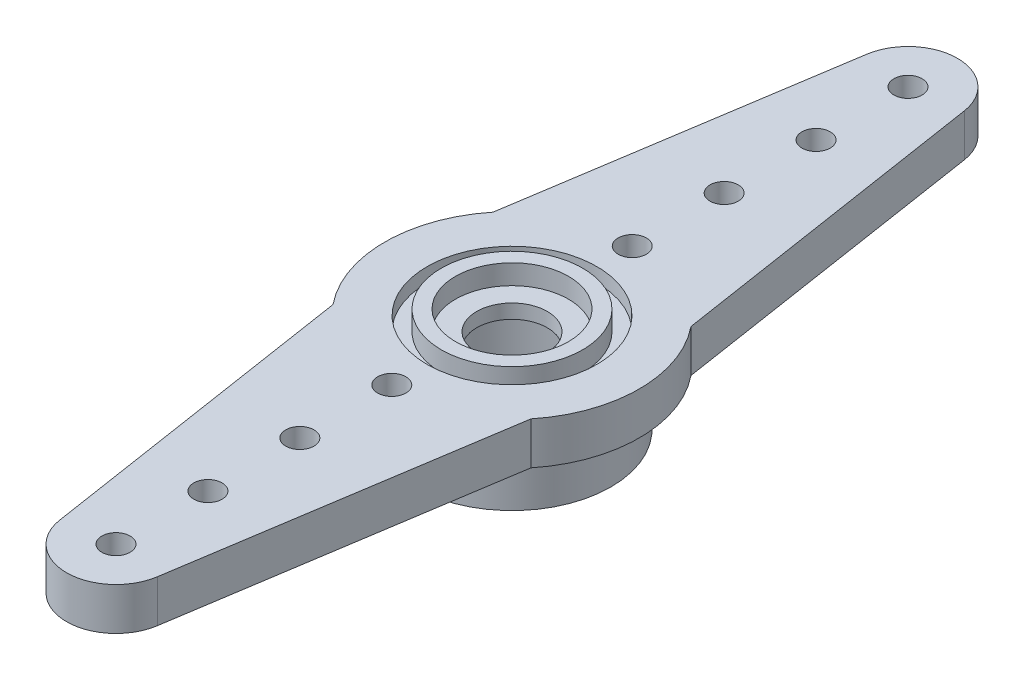
ISO-10303-21;
HEADER;
FILE_DESCRIPTION(('STEP AP214'),'2;1');
FILE_NAME('part.step','',(''),(''),'','','');
FILE_SCHEMA(('AUTOMOTIVE_DESIGN { 1 0 10303 214 1 1 1 1 }'));
ENDSEC;
DATA;
#1=APPLICATION_CONTEXT('core data for automotive mechanical design processes');
#2=APPLICATION_PROTOCOL_DEFINITION('international standard','automotive_design',2000,#1);
#3=PRODUCT_CONTEXT('',#1,'mechanical');
#4=PRODUCT('Part','Part','',(#3));
#5=PRODUCT_RELATED_PRODUCT_CATEGORY('part','',(#4));
#6=PRODUCT_DEFINITION_FORMATION('','',#4);
#7=PRODUCT_DEFINITION_CONTEXT('part definition',#1,'design');
#8=PRODUCT_DEFINITION('design','',#6,#7);
#9=PRODUCT_DEFINITION_SHAPE('','',#8);
#10=(LENGTH_UNIT() NAMED_UNIT(*) SI_UNIT(.MILLI.,.METRE.));
#11=(NAMED_UNIT(*) PLANE_ANGLE_UNIT() SI_UNIT($,.RADIAN.));
#12=(NAMED_UNIT(*) SI_UNIT($,.STERADIAN.) SOLID_ANGLE_UNIT());
#13=UNCERTAINTY_MEASURE_WITH_UNIT(LENGTH_MEASURE(1.E-05),#10,'distance_accuracy_value','');
#14=(GEOMETRIC_REPRESENTATION_CONTEXT(3) GLOBAL_UNCERTAINTY_ASSIGNED_CONTEXT((#13)) GLOBAL_UNIT_ASSIGNED_CONTEXT((#10,
#11,#12)) REPRESENTATION_CONTEXT('',''));
#15=CARTESIAN_POINT('',(0.,0.,0.));
#16=DIRECTION('',(0.,0.,1.));
#17=DIRECTION('',(1.,0.,0.));
#18=AXIS2_PLACEMENT_3D('',#15,#16,#17);
#19=CARTESIAN_POINT('',(0.,1.5,0.));
#20=DIRECTION('',(0.,-1.,0.));
#21=DIRECTION('',(0.,0.,-1.));
#22=AXIS2_PLACEMENT_3D('',#19,#20,#21);
#23=CYLINDRICAL_SURFACE('',#22,4.5);
#24=DIRECTION('',(0.,-1.,0.));
#25=VECTOR('',#24,1.);
#26=CARTESIAN_POINT('',(-3.5,1.5,2.82842712474619));
#27=LINE('',#26,#25);
#28=CARTESIAN_POINT('',(-3.5,1.5,2.82842712474619));
#29=VERTEX_POINT('',#28);
#30=CARTESIAN_POINT('',(-3.5,0.,2.82842712474619));
#31=VERTEX_POINT('',#30);
#32=EDGE_CURVE('E64',#29,#31,#27,.T.);
#33=ORIENTED_EDGE('',*,*,#32,.F.);
#34=CARTESIAN_POINT('',(0.,1.5,0.));
#35=DIRECTION('',(0.,1.,0.));
#36=DIRECTION('',(0.,0.,1.));
#37=AXIS2_PLACEMENT_3D('',#34,#35,#36);
#38=CIRCLE('',#37,4.5);
#39=CARTESIAN_POINT('',(-3.5,1.5,-2.82842712474619));
#40=VERTEX_POINT('',#39);
#41=EDGE_CURVE('E114',#40,#29,#38,.T.);
#42=ORIENTED_EDGE('',*,*,#41,.F.);
#43=DIRECTION('',(0.,-1.,0.));
#44=VECTOR('',#43,1.);
#45=CARTESIAN_POINT('',(-3.5,1.5,-2.82842712474619));
#46=LINE('',#45,#44);
#47=CARTESIAN_POINT('',(-3.5,0.,-2.82842712474619));
#48=VERTEX_POINT('',#47);
#49=EDGE_CURVE('E171',#40,#48,#46,.T.);
#50=ORIENTED_EDGE('',*,*,#49,.T.);
#51=CARTESIAN_POINT('',(0.,0.,0.));
#52=DIRECTION('',(0.,1.,0.));
#53=DIRECTION('',(0.,0.,1.));
#54=AXIS2_PLACEMENT_3D('',#51,#52,#53);
#55=CIRCLE('',#54,4.5);
#56=EDGE_CURVE('E190',#48,#31,#55,.T.);
#57=ORIENTED_EDGE('',*,*,#56,.T.);
#58=EDGE_LOOP('',(#33,#42,#50,#57));
#59=FACE_BOUND('',#58,.T.);
#60=ADVANCED_FACE('F41',(#59),#23,.T.);
#61=DIRECTION('',(0.,-1.,0.));
#62=VECTOR('',#61,1.);
#63=CARTESIAN_POINT('',(3.5,1.5,2.82842712474619));
#64=LINE('',#63,#62);
#65=CARTESIAN_POINT('',(3.5,1.5,2.82842712474619));
#66=VERTEX_POINT('',#65);
#67=CARTESIAN_POINT('',(3.5,0.,2.82842712474619));
#68=VERTEX_POINT('',#67);
#69=EDGE_CURVE('E132',#66,#68,#64,.T.);
#70=ORIENTED_EDGE('',*,*,#69,.T.);
#71=CARTESIAN_POINT('',(3.5,0.,-2.82842712474619));
#72=VERTEX_POINT('',#71);
#73=EDGE_CURVE('E188',#68,#72,#55,.T.);
#74=ORIENTED_EDGE('',*,*,#73,.T.);
#75=DIRECTION('',(0.,-1.,0.));
#76=VECTOR('',#75,1.);
#77=CARTESIAN_POINT('',(3.5,1.5,-2.82842712474619));
#78=LINE('',#77,#76);
#79=CARTESIAN_POINT('',(3.5,1.5,-2.82842712474619));
#80=VERTEX_POINT('',#79);
#81=EDGE_CURVE('E185',#80,#72,#78,.T.);
#82=ORIENTED_EDGE('',*,*,#81,.F.);
#83=EDGE_CURVE('E56',#66,#80,#38,.T.);
#84=ORIENTED_EDGE('',*,*,#83,.F.);
#85=EDGE_LOOP('',(#70,#74,#82,#84));
#86=FACE_BOUND('',#85,.T.);
#87=ADVANCED_FACE('F238',(#86),#23,.T.);
#88=CARTESIAN_POINT('',(0.,1.5,0.));
#89=DIRECTION('',(0.,1.,0.));
#90=DIRECTION('',(0.,0.,1.));
#91=AXIS2_PLACEMENT_3D('',#88,#89,#90);
#92=PLANE('',#91);
#93=CARTESIAN_POINT('',(0.,1.5,0.));
#94=DIRECTION('',(0.,1.,0.));
#95=DIRECTION('',(0.,0.,1.));
#96=AXIS2_PLACEMENT_3D('',#93,#94,#95);
#97=CIRCLE('',#96,3.);
#98=CARTESIAN_POINT('',(0.,1.5,3.));
#99=VERTEX_POINT('',#98);
#100=EDGE_CURVE('E522',#99,#99,#97,.T.);
#101=ORIENTED_EDGE('',*,*,#100,.F.);
#102=EDGE_LOOP('',(#101));
#103=FACE_BOUND('',#102,.T.);
#104=CARTESIAN_POINT('',(0.,1.5,14.));
#105=DIRECTION('',(0.,1.,0.));
#106=DIRECTION('',(0.,0.,1.));
#107=AXIS2_PLACEMENT_3D('',#104,#105,#106);
#108=CIRCLE('',#107,0.499999999999999);
#109=CARTESIAN_POINT('',(0.,1.5,14.5));
#110=VERTEX_POINT('',#109);
#111=EDGE_CURVE('E528',#110,#110,#108,.T.);
#112=ORIENTED_EDGE('',*,*,#111,.F.);
#113=EDGE_LOOP('',(#112));
#114=FACE_BOUND('',#113,.T.);
#115=CARTESIAN_POINT('',(0.,1.5,10.75));
#116=DIRECTION('',(0.,1.,0.));
#117=DIRECTION('',(0.,0.,1.));
#118=AXIS2_PLACEMENT_3D('',#115,#116,#117);
#119=CIRCLE('',#118,0.499999999999999);
#120=CARTESIAN_POINT('',(0.,1.5,11.25));
#121=VERTEX_POINT('',#120);
#122=EDGE_CURVE('E208',#121,#121,#119,.T.);
#123=ORIENTED_EDGE('',*,*,#122,.F.);
#124=EDGE_LOOP('',(#123));
#125=FACE_BOUND('',#124,.T.);
#126=CARTESIAN_POINT('',(0.,1.5,7.5));
#127=DIRECTION('',(0.,1.,0.));
#128=DIRECTION('',(0.,0.,1.));
#129=AXIS2_PLACEMENT_3D('',#126,#127,#128);
#130=CIRCLE('',#129,0.499999999999999);
#131=CARTESIAN_POINT('',(0.,1.5,8.));
#132=VERTEX_POINT('',#131);
#133=EDGE_CURVE('E204',#132,#132,#130,.T.);
#134=ORIENTED_EDGE('',*,*,#133,.F.);
#135=EDGE_LOOP('',(#134));
#136=FACE_BOUND('',#135,.T.);
#137=CARTESIAN_POINT('',(0.,1.5,4.25));
#138=DIRECTION('',(0.,1.,0.));
#139=DIRECTION('',(0.,0.,1.));
#140=AXIS2_PLACEMENT_3D('',#137,#138,#139);
#141=CIRCLE('',#140,0.499999999999999);
#142=CARTESIAN_POINT('',(0.,1.5,4.75));
#143=VERTEX_POINT('',#142);
#144=EDGE_CURVE('E200',#143,#143,#141,.T.);
#145=ORIENTED_EDGE('',*,*,#144,.F.);
#146=EDGE_LOOP('',(#145));
#147=FACE_BOUND('',#146,.T.);
#148=ORIENTED_EDGE('',*,*,#41,.T.);
#149=DIRECTION('',(0.152960814944078,0.,0.988232254630279));
#150=VECTOR('',#149,1.);
#151=CARTESIAN_POINT('',(-3.5,1.5,2.82842712474619));
#152=LINE('',#151,#150);
#153=CARTESIAN_POINT('',(-1.72940644560299,1.5,14.2676814261521));
#154=VERTEX_POINT('',#153);
#155=EDGE_CURVE('E106',#29,#154,#152,.T.);
#156=ORIENTED_EDGE('',*,*,#155,.T.);
#157=CARTESIAN_POINT('',(0.,1.5,14.));
#158=DIRECTION('',(0.,1.,0.));
#159=DIRECTION('',(0.,0.,-1.));
#160=AXIS2_PLACEMENT_3D('',#157,#158,#159);
#161=CIRCLE('',#160,1.75);
#162=CARTESIAN_POINT('',(1.72940644560299,1.5,14.2676814261521));
#163=VERTEX_POINT('',#162);
#164=EDGE_CURVE('E111',#154,#163,#161,.T.);
#165=ORIENTED_EDGE('',*,*,#164,.T.);
#166=DIRECTION('',(0.152960814944078,0.,-0.988232254630279));
#167=VECTOR('',#166,1.);
#168=CARTESIAN_POINT('',(1.72940644560299,1.5,14.2676814261521));
#169=LINE('',#168,#167);
#170=EDGE_CURVE('E130',#163,#66,#169,.T.);
#171=ORIENTED_EDGE('',*,*,#170,.T.);
#172=ORIENTED_EDGE('',*,*,#83,.T.);
#173=DIRECTION('',(-0.152960814944078,0.,-0.988232254630279));
#174=VECTOR('',#173,1.);
#175=CARTESIAN_POINT('',(3.5,1.5,-2.82842712474619));
#176=LINE('',#175,#174);
#177=CARTESIAN_POINT('',(1.72940644560299,1.5,-14.2676814261521));
#178=VERTEX_POINT('',#177);
#179=EDGE_CURVE('E164',#80,#178,#176,.T.);
#180=ORIENTED_EDGE('',*,*,#179,.T.);
#181=CARTESIAN_POINT('',(0.,1.5,-14.));
#182=DIRECTION('',(0.,1.,0.));
#183=DIRECTION('',(0.,0.,1.));
#184=AXIS2_PLACEMENT_3D('',#181,#182,#183);
#185=CIRCLE('',#184,1.75);
#186=CARTESIAN_POINT('',(-1.72940644560299,1.5,-14.2676814261521));
#187=VERTEX_POINT('',#186);
#188=EDGE_CURVE('E166',#178,#187,#185,.T.);
#189=ORIENTED_EDGE('',*,*,#188,.T.);
#190=DIRECTION('',(-0.152960814944078,0.,0.988232254630279));
#191=VECTOR('',#190,1.);
#192=CARTESIAN_POINT('',(-1.72940644560299,1.5,-14.2676814261521));
#193=LINE('',#192,#191);
#194=EDGE_CURVE('E169',#187,#40,#193,.T.);
#195=ORIENTED_EDGE('',*,*,#194,.T.);
#196=EDGE_LOOP('',(#148,#156,#165,#171,#172,#180,#189,#195));
#197=FACE_BOUND('',#196,.T.);
#198=CARTESIAN_POINT('',(0.,1.5,-14.));
#199=DIRECTION('',(0.,1.,0.));
#200=DIRECTION('',(0.,0.,1.));
#201=AXIS2_PLACEMENT_3D('',#198,#199,#200);
#202=CIRCLE('',#201,0.499999999999999);
#203=CARTESIAN_POINT('',(0.,1.5,-13.5));
#204=VERTEX_POINT('',#203);
#205=EDGE_CURVE('E145',#204,#204,#202,.T.);
#206=ORIENTED_EDGE('',*,*,#205,.F.);
#207=EDGE_LOOP('',(#206));
#208=FACE_BOUND('',#207,.T.);
#209=CARTESIAN_POINT('',(0.,1.5,-10.75));
#210=DIRECTION('',(0.,1.,0.));
#211=DIRECTION('',(0.,0.,1.));
#212=AXIS2_PLACEMENT_3D('',#209,#210,#211);
#213=CIRCLE('',#212,0.499999999999999);
#214=CARTESIAN_POINT('',(0.,1.5,-10.25));
#215=VERTEX_POINT('',#214);
#216=EDGE_CURVE('E149',#215,#215,#213,.T.);
#217=ORIENTED_EDGE('',*,*,#216,.F.);
#218=EDGE_LOOP('',(#217));
#219=FACE_BOUND('',#218,.T.);
#220=CARTESIAN_POINT('',(0.,1.5,-7.5));
#221=DIRECTION('',(0.,1.,0.));
#222=DIRECTION('',(0.,0.,1.));
#223=AXIS2_PLACEMENT_3D('',#220,#221,#222);
#224=CIRCLE('',#223,0.499999999999999);
#225=CARTESIAN_POINT('',(0.,1.5,-7.));
#226=VERTEX_POINT('',#225);
#227=EDGE_CURVE('E153',#226,#226,#224,.T.);
#228=ORIENTED_EDGE('',*,*,#227,.F.);
#229=EDGE_LOOP('',(#228));
#230=FACE_BOUND('',#229,.T.);
#231=CARTESIAN_POINT('',(0.,1.5,-4.25));
#232=DIRECTION('',(0.,1.,0.));
#233=DIRECTION('',(0.,0.,1.));
#234=AXIS2_PLACEMENT_3D('',#231,#232,#233);
#235=CIRCLE('',#234,0.499999999999999);
#236=CARTESIAN_POINT('',(0.,1.5,-3.75));
#237=VERTEX_POINT('',#236);
#238=EDGE_CURVE('E157',#237,#237,#235,.T.);
#239=ORIENTED_EDGE('',*,*,#238,.F.);
#240=EDGE_LOOP('',(#239));
#241=FACE_BOUND('',#240,.T.);
#242=ADVANCED_FACE('F108',(#103,#114,#125,#136,#147,#197,#208,#219,#230,#241),#92,.T.);
#243=CARTESIAN_POINT('',(0.,0.,0.));
#244=DIRECTION('',(0.,1.,0.));
#245=DIRECTION('',(0.,0.,1.));
#246=AXIS2_PLACEMENT_3D('',#243,#244,#245);
#247=PLANE('',#246);
#248=CARTESIAN_POINT('',(0.,0.,0.));
#249=DIRECTION('',(0.,1.,0.));
#250=DIRECTION('',(0.,0.,1.));
#251=AXIS2_PLACEMENT_3D('',#248,#249,#250);
#252=CIRCLE('',#251,3.5);
#253=CARTESIAN_POINT('',(0.,0.,3.5));
#254=VERTEX_POINT('',#253);
#255=EDGE_CURVE('E13',#254,#254,#252,.F.);
#256=ORIENTED_EDGE('',*,*,#255,.F.);
#257=EDGE_LOOP('',(#256));
#258=FACE_BOUND('',#257,.T.);
#259=CARTESIAN_POINT('',(0.,0.,14.));
#260=DIRECTION('',(0.,1.,0.));
#261=DIRECTION('',(0.,0.,1.));
#262=AXIS2_PLACEMENT_3D('',#259,#260,#261);
#263=CIRCLE('',#262,0.499999999999999);
#264=CARTESIAN_POINT('',(0.,0.,14.5));
#265=VERTEX_POINT('',#264);
#266=EDGE_CURVE('E292',#265,#265,#263,.T.);
#267=ORIENTED_EDGE('',*,*,#266,.T.);
#268=EDGE_LOOP('',(#267));
#269=FACE_BOUND('',#268,.T.);
#270=CARTESIAN_POINT('',(0.,0.,10.75));
#271=DIRECTION('',(0.,1.,0.));
#272=DIRECTION('',(0.,0.,1.));
#273=AXIS2_PLACEMENT_3D('',#270,#271,#272);
#274=CIRCLE('',#273,0.499999999999999);
#275=CARTESIAN_POINT('',(0.,0.,11.25));
#276=VERTEX_POINT('',#275);
#277=EDGE_CURVE('E205',#276,#276,#274,.T.);
#278=ORIENTED_EDGE('',*,*,#277,.T.);
#279=EDGE_LOOP('',(#278));
#280=FACE_BOUND('',#279,.T.);
#281=CARTESIAN_POINT('',(0.,0.,7.5));
#282=DIRECTION('',(0.,1.,0.));
#283=DIRECTION('',(0.,0.,1.));
#284=AXIS2_PLACEMENT_3D('',#281,#282,#283);
#285=CIRCLE('',#284,0.499999999999999);
#286=CARTESIAN_POINT('',(0.,0.,8.));
#287=VERTEX_POINT('',#286);
#288=EDGE_CURVE('E201',#287,#287,#285,.T.);
#289=ORIENTED_EDGE('',*,*,#288,.T.);
#290=EDGE_LOOP('',(#289));
#291=FACE_BOUND('',#290,.T.);
#292=CARTESIAN_POINT('',(0.,0.,4.25));
#293=DIRECTION('',(0.,1.,0.));
#294=DIRECTION('',(0.,0.,1.));
#295=AXIS2_PLACEMENT_3D('',#292,#293,#294);
#296=CIRCLE('',#295,0.499999999999999);
#297=CARTESIAN_POINT('',(0.,0.,4.75));
#298=VERTEX_POINT('',#297);
#299=EDGE_CURVE('E138',#298,#298,#296,.T.);
#300=ORIENTED_EDGE('',*,*,#299,.T.);
#301=EDGE_LOOP('',(#300));
#302=FACE_BOUND('',#301,.T.);
#303=ORIENTED_EDGE('',*,*,#73,.F.);
#304=DIRECTION('',(0.152960814944078,0.,-0.988232254630279));
#305=VECTOR('',#304,1.);
#306=CARTESIAN_POINT('',(1.72940644560299,0.,14.2676814261521));
#307=LINE('',#306,#305);
#308=CARTESIAN_POINT('',(1.72940644560299,0.,14.2676814261521));
#309=VERTEX_POINT('',#308);
#310=EDGE_CURVE('E116',#309,#68,#307,.T.);
#311=ORIENTED_EDGE('',*,*,#310,.F.);
#312=CARTESIAN_POINT('',(0.,0.,14.));
#313=DIRECTION('',(0.,1.,0.));
#314=DIRECTION('',(0.,0.,-1.));
#315=AXIS2_PLACEMENT_3D('',#312,#313,#314);
#316=CIRCLE('',#315,1.75);
#317=CARTESIAN_POINT('',(-1.72940644560299,0.,14.2676814261521));
#318=VERTEX_POINT('',#317);
#319=EDGE_CURVE('E137',#318,#309,#316,.T.);
#320=ORIENTED_EDGE('',*,*,#319,.F.);
#321=DIRECTION('',(0.152960814944078,0.,0.988232254630279));
#322=VECTOR('',#321,1.);
#323=CARTESIAN_POINT('',(-3.5,0.,2.82842712474619));
#324=LINE('',#323,#322);
#325=EDGE_CURVE('E122',#31,#318,#324,.T.);
#326=ORIENTED_EDGE('',*,*,#325,.F.);
#327=ORIENTED_EDGE('',*,*,#56,.F.);
#328=DIRECTION('',(-0.152960814944078,0.,0.988232254630279));
#329=VECTOR('',#328,1.);
#330=CARTESIAN_POINT('',(-1.72940644560299,0.,-14.2676814261521));
#331=LINE('',#330,#329);
#332=CARTESIAN_POINT('',(-1.72940644560299,0.,-14.2676814261521));
#333=VERTEX_POINT('',#332);
#334=EDGE_CURVE('E167',#333,#48,#331,.T.);
#335=ORIENTED_EDGE('',*,*,#334,.F.);
#336=CARTESIAN_POINT('',(0.,0.,-14.));
#337=DIRECTION('',(0.,1.,0.));
#338=DIRECTION('',(0.,0.,1.));
#339=AXIS2_PLACEMENT_3D('',#336,#337,#338);
#340=CIRCLE('',#339,1.75);
#341=CARTESIAN_POINT('',(1.72940644560299,0.,-14.2676814261521));
#342=VERTEX_POINT('',#341);
#343=EDGE_CURVE('E173',#342,#333,#340,.T.);
#344=ORIENTED_EDGE('',*,*,#343,.F.);
#345=DIRECTION('',(-0.152960814944078,0.,-0.988232254630279));
#346=VECTOR('',#345,1.);
#347=CARTESIAN_POINT('',(3.5,0.,-2.82842712474619));
#348=LINE('',#347,#346);
#349=EDGE_CURVE('E163',#72,#342,#348,.T.);
#350=ORIENTED_EDGE('',*,*,#349,.F.);
#351=EDGE_LOOP('',(#303,#311,#320,#326,#327,#335,#344,#350));
#352=FACE_BOUND('',#351,.T.);
#353=CARTESIAN_POINT('',(0.,0.,-4.25));
#354=DIRECTION('',(0.,1.,0.));
#355=DIRECTION('',(0.,0.,1.));
#356=AXIS2_PLACEMENT_3D('',#353,#354,#355);
#357=CIRCLE('',#356,0.499999999999999);
#358=CARTESIAN_POINT('',(0.,0.,-3.75));
#359=VERTEX_POINT('',#358);
#360=EDGE_CURVE('E160',#359,#359,#357,.T.);
#361=ORIENTED_EDGE('',*,*,#360,.T.);
#362=EDGE_LOOP('',(#361));
#363=FACE_BOUND('',#362,.T.);
#364=CARTESIAN_POINT('',(0.,0.,-7.5));
#365=DIRECTION('',(0.,1.,0.));
#366=DIRECTION('',(0.,0.,1.));
#367=AXIS2_PLACEMENT_3D('',#364,#365,#366);
#368=CIRCLE('',#367,0.499999999999999);
#369=CARTESIAN_POINT('',(0.,0.,-7.));
#370=VERTEX_POINT('',#369);
#371=EDGE_CURVE('E156',#370,#370,#368,.T.);
#372=ORIENTED_EDGE('',*,*,#371,.T.);
#373=EDGE_LOOP('',(#372));
#374=FACE_BOUND('',#373,.T.);
#375=CARTESIAN_POINT('',(0.,0.,-10.75));
#376=DIRECTION('',(0.,1.,0.));
#377=DIRECTION('',(0.,0.,1.));
#378=AXIS2_PLACEMENT_3D('',#375,#376,#377);
#379=CIRCLE('',#378,0.499999999999999);
#380=CARTESIAN_POINT('',(0.,0.,-10.25));
#381=VERTEX_POINT('',#380);
#382=EDGE_CURVE('E152',#381,#381,#379,.T.);
#383=ORIENTED_EDGE('',*,*,#382,.T.);
#384=EDGE_LOOP('',(#383));
#385=FACE_BOUND('',#384,.T.);
#386=CARTESIAN_POINT('',(0.,0.,-14.));
#387=DIRECTION('',(0.,1.,0.));
#388=DIRECTION('',(0.,0.,1.));
#389=AXIS2_PLACEMENT_3D('',#386,#387,#388);
#390=CIRCLE('',#389,0.499999999999999);
#391=CARTESIAN_POINT('',(0.,0.,-13.5));
#392=VERTEX_POINT('',#391);
#393=EDGE_CURVE('E148',#392,#392,#390,.T.);
#394=ORIENTED_EDGE('',*,*,#393,.T.);
#395=EDGE_LOOP('',(#394));
#396=FACE_BOUND('',#395,.T.);
#397=ADVANCED_FACE('F245',(#258,#269,#280,#291,#302,#352,#363,#374,#385,#396),#247,.F.);
#398=CARTESIAN_POINT('',(3.5,1.5,-2.82842712474619));
#399=DIRECTION('',(-0.988232254630279,0.,0.152960814944078));
#400=DIRECTION('',(0.152960814944078,0.,0.988232254630279));
#401=AXIS2_PLACEMENT_3D('',#398,#399,#400);
#402=PLANE('',#401);
#403=ORIENTED_EDGE('',*,*,#349,.T.);
#404=DIRECTION('',(0.,-1.,0.));
#405=VECTOR('',#404,1.);
#406=CARTESIAN_POINT('',(1.72940644560299,1.5,-14.2676814261521));
#407=LINE('',#406,#405);
#408=EDGE_CURVE('E182',#178,#342,#407,.T.);
#409=ORIENTED_EDGE('',*,*,#408,.F.);
#410=ORIENTED_EDGE('',*,*,#179,.F.);
#411=ORIENTED_EDGE('',*,*,#81,.T.);
#412=EDGE_LOOP('',(#403,#409,#410,#411));
#413=FACE_BOUND('',#412,.T.);
#414=ADVANCED_FACE('F260',(#413),#402,.F.);
#415=CARTESIAN_POINT('',(0.,1.5,-14.));
#416=DIRECTION('',(0.,-1.,0.));
#417=DIRECTION('',(0.,0.,-1.));
#418=AXIS2_PLACEMENT_3D('',#415,#416,#417);
#419=CYLINDRICAL_SURFACE('',#418,1.75);
#420=ORIENTED_EDGE('',*,*,#343,.T.);
#421=DIRECTION('',(0.,-1.,0.));
#422=VECTOR('',#421,1.);
#423=CARTESIAN_POINT('',(-1.72940644560299,1.5,-14.2676814261521));
#424=LINE('',#423,#422);
#425=EDGE_CURVE('E179',#187,#333,#424,.T.);
#426=ORIENTED_EDGE('',*,*,#425,.F.);
#427=ORIENTED_EDGE('',*,*,#188,.F.);
#428=ORIENTED_EDGE('',*,*,#408,.T.);
#429=EDGE_LOOP('',(#420,#426,#427,#428));
#430=FACE_BOUND('',#429,.T.);
#431=ADVANCED_FACE('F266',(#430),#419,.T.);
#432=CARTESIAN_POINT('',(-1.72940644560299,1.5,-14.2676814261521));
#433=DIRECTION('',(0.988232254630279,0.,0.152960814944078));
#434=DIRECTION('',(0.152960814944078,0.,-0.988232254630279));
#435=AXIS2_PLACEMENT_3D('',#432,#433,#434);
#436=PLANE('',#435);
#437=ORIENTED_EDGE('',*,*,#334,.T.);
#438=ORIENTED_EDGE('',*,*,#49,.F.);
#439=ORIENTED_EDGE('',*,*,#194,.F.);
#440=ORIENTED_EDGE('',*,*,#425,.T.);
#441=EDGE_LOOP('',(#437,#438,#439,#440));
#442=FACE_BOUND('',#441,.T.);
#443=ADVANCED_FACE('F268',(#442),#436,.F.);
#444=CARTESIAN_POINT('',(0.,1.5,-4.25));
#445=DIRECTION('',(0.,1.,0.));
#446=DIRECTION('',(0.,0.,1.));
#447=AXIS2_PLACEMENT_3D('',#444,#445,#446);
#448=CYLINDRICAL_SURFACE('',#447,0.499999999999999);
#449=ORIENTED_EDGE('',*,*,#238,.T.);
#450=EDGE_LOOP('',(#449));
#451=FACE_BOUND('',#450,.T.);
#452=ORIENTED_EDGE('',*,*,#360,.F.);
#453=EDGE_LOOP('',(#452));
#454=FACE_BOUND('',#453,.T.);
#455=ADVANCED_FACE('F270',(#451,#454),#448,.F.);
#456=CARTESIAN_POINT('',(0.,1.5,-7.5));
#457=DIRECTION('',(0.,1.,0.));
#458=DIRECTION('',(0.,0.,1.));
#459=AXIS2_PLACEMENT_3D('',#456,#457,#458);
#460=CYLINDRICAL_SURFACE('',#459,0.499999999999999);
#461=ORIENTED_EDGE('',*,*,#227,.T.);
#462=EDGE_LOOP('',(#461));
#463=FACE_BOUND('',#462,.T.);
#464=ORIENTED_EDGE('',*,*,#371,.F.);
#465=EDGE_LOOP('',(#464));
#466=FACE_BOUND('',#465,.T.);
#467=ADVANCED_FACE('F276',(#463,#466),#460,.F.);
#468=CARTESIAN_POINT('',(0.,1.5,-10.75));
#469=DIRECTION('',(0.,1.,0.));
#470=DIRECTION('',(0.,0.,1.));
#471=AXIS2_PLACEMENT_3D('',#468,#469,#470);
#472=CYLINDRICAL_SURFACE('',#471,0.499999999999999);
#473=ORIENTED_EDGE('',*,*,#216,.T.);
#474=EDGE_LOOP('',(#473));
#475=FACE_BOUND('',#474,.T.);
#476=ORIENTED_EDGE('',*,*,#382,.F.);
#477=EDGE_LOOP('',(#476));
#478=FACE_BOUND('',#477,.T.);
#479=ADVANCED_FACE('F322',(#475,#478),#472,.F.);
#480=CARTESIAN_POINT('',(0.,1.5,-14.));
#481=DIRECTION('',(0.,1.,0.));
#482=DIRECTION('',(0.,0.,1.));
#483=AXIS2_PLACEMENT_3D('',#480,#481,#482);
#484=CYLINDRICAL_SURFACE('',#483,0.499999999999999);
#485=ORIENTED_EDGE('',*,*,#205,.T.);
#486=EDGE_LOOP('',(#485));
#487=FACE_BOUND('',#486,.T.);
#488=ORIENTED_EDGE('',*,*,#393,.F.);
#489=EDGE_LOOP('',(#488));
#490=FACE_BOUND('',#489,.T.);
#491=ADVANCED_FACE('F319',(#487,#490),#484,.F.);
#492=CARTESIAN_POINT('',(-3.5,1.5,2.82842712474619));
#493=DIRECTION('',(0.988232254630279,0.,-0.152960814944078));
#494=DIRECTION('',(-0.152960814944078,0.,-0.988232254630279));
#495=AXIS2_PLACEMENT_3D('',#492,#493,#494);
#496=PLANE('',#495);
#497=ORIENTED_EDGE('',*,*,#325,.T.);
#498=DIRECTION('',(0.,-1.,0.));
#499=VECTOR('',#498,1.);
#500=CARTESIAN_POINT('',(-1.72940644560299,1.5,14.2676814261521));
#501=LINE('',#500,#499);
#502=EDGE_CURVE('E119',#154,#318,#501,.T.);
#503=ORIENTED_EDGE('',*,*,#502,.F.);
#504=ORIENTED_EDGE('',*,*,#155,.F.);
#505=ORIENTED_EDGE('',*,*,#32,.T.);
#506=EDGE_LOOP('',(#497,#503,#504,#505));
#507=FACE_BOUND('',#506,.T.);
#508=ADVANCED_FACE('F120',(#507),#496,.F.);
#509=CARTESIAN_POINT('',(0.,1.5,14.));
#510=DIRECTION('',(0.,-1.,0.));
#511=DIRECTION('',(0.,0.,-1.));
#512=AXIS2_PLACEMENT_3D('',#509,#510,#511);
#513=CYLINDRICAL_SURFACE('',#512,1.75);
#514=ORIENTED_EDGE('',*,*,#319,.T.);
#515=DIRECTION('',(0.,-1.,0.));
#516=VECTOR('',#515,1.);
#517=CARTESIAN_POINT('',(1.72940644560299,1.5,14.2676814261521));
#518=LINE('',#517,#516);
#519=EDGE_CURVE('E125',#163,#309,#518,.T.);
#520=ORIENTED_EDGE('',*,*,#519,.F.);
#521=ORIENTED_EDGE('',*,*,#164,.F.);
#522=ORIENTED_EDGE('',*,*,#502,.T.);
#523=EDGE_LOOP('',(#514,#520,#521,#522));
#524=FACE_BOUND('',#523,.T.);
#525=ADVANCED_FACE('F127',(#524),#513,.T.);
#526=CARTESIAN_POINT('',(1.72940644560299,1.5,14.2676814261521));
#527=DIRECTION('',(-0.988232254630279,0.,-0.152960814944078));
#528=DIRECTION('',(-0.152960814944078,0.,0.988232254630279));
#529=AXIS2_PLACEMENT_3D('',#526,#527,#528);
#530=PLANE('',#529);
#531=ORIENTED_EDGE('',*,*,#310,.T.);
#532=ORIENTED_EDGE('',*,*,#69,.F.);
#533=ORIENTED_EDGE('',*,*,#170,.F.);
#534=ORIENTED_EDGE('',*,*,#519,.T.);
#535=EDGE_LOOP('',(#531,#532,#533,#534));
#536=FACE_BOUND('',#535,.T.);
#537=ADVANCED_FACE('F252',(#536),#530,.F.);
#538=CARTESIAN_POINT('',(0.,1.5,4.25));
#539=DIRECTION('',(0.,1.,0.));
#540=DIRECTION('',(0.,0.,1.));
#541=AXIS2_PLACEMENT_3D('',#538,#539,#540);
#542=CYLINDRICAL_SURFACE('',#541,0.499999999999999);
#543=ORIENTED_EDGE('',*,*,#144,.T.);
#544=EDGE_LOOP('',(#543));
#545=FACE_BOUND('',#544,.T.);
#546=ORIENTED_EDGE('',*,*,#299,.F.);
#547=EDGE_LOOP('',(#546));
#548=FACE_BOUND('',#547,.T.);
#549=ADVANCED_FACE('F299',(#545,#548),#542,.F.);
#550=CARTESIAN_POINT('',(0.,1.5,7.5));
#551=DIRECTION('',(0.,1.,0.));
#552=DIRECTION('',(0.,0.,1.));
#553=AXIS2_PLACEMENT_3D('',#550,#551,#552);
#554=CYLINDRICAL_SURFACE('',#553,0.499999999999999);
#555=ORIENTED_EDGE('',*,*,#133,.T.);
#556=EDGE_LOOP('',(#555));
#557=FACE_BOUND('',#556,.T.);
#558=ORIENTED_EDGE('',*,*,#288,.F.);
#559=EDGE_LOOP('',(#558));
#560=FACE_BOUND('',#559,.T.);
#561=ADVANCED_FACE('F301',(#557,#560),#554,.F.);
#562=CARTESIAN_POINT('',(0.,1.5,10.75));
#563=DIRECTION('',(0.,1.,0.));
#564=DIRECTION('',(0.,0.,1.));
#565=AXIS2_PLACEMENT_3D('',#562,#563,#564);
#566=CYLINDRICAL_SURFACE('',#565,0.499999999999999);
#567=ORIENTED_EDGE('',*,*,#122,.T.);
#568=EDGE_LOOP('',(#567));
#569=FACE_BOUND('',#568,.T.);
#570=ORIENTED_EDGE('',*,*,#277,.F.);
#571=EDGE_LOOP('',(#570));
#572=FACE_BOUND('',#571,.T.);
#573=ADVANCED_FACE('F308',(#569,#572),#566,.F.);
#574=CARTESIAN_POINT('',(0.,1.5,14.));
#575=DIRECTION('',(0.,1.,0.));
#576=DIRECTION('',(0.,0.,1.));
#577=AXIS2_PLACEMENT_3D('',#574,#575,#576);
#578=CYLINDRICAL_SURFACE('',#577,0.499999999999999);
#579=ORIENTED_EDGE('',*,*,#111,.T.);
#580=EDGE_LOOP('',(#579));
#581=FACE_BOUND('',#580,.T.);
#582=ORIENTED_EDGE('',*,*,#266,.F.);
#583=EDGE_LOOP('',(#582));
#584=FACE_BOUND('',#583,.T.);
#585=ADVANCED_FACE('F386',(#581,#584),#578,.F.);
#586=CARTESIAN_POINT('',(0.,1.,0.));
#587=DIRECTION('',(0.,1.,0.));
#588=DIRECTION('',(0.,0.,1.));
#589=AXIS2_PLACEMENT_3D('',#586,#587,#588);
#590=CYLINDRICAL_SURFACE('',#589,3.);
#591=CARTESIAN_POINT('',(0.,1.,0.));
#592=DIRECTION('',(0.,1.,0.));
#593=DIRECTION('',(0.,0.,1.));
#594=AXIS2_PLACEMENT_3D('',#591,#592,#593);
#595=CIRCLE('',#594,3.);
#596=CARTESIAN_POINT('',(0.,1.,3.));
#597=VERTEX_POINT('',#596);
#598=EDGE_CURVE('E525',#597,#597,#595,.T.);
#599=ORIENTED_EDGE('',*,*,#598,.F.);
#600=EDGE_LOOP('',(#599));
#601=FACE_BOUND('',#600,.T.);
#602=ORIENTED_EDGE('',*,*,#100,.T.);
#603=EDGE_LOOP('',(#602));
#604=FACE_BOUND('',#603,.T.);
#605=ADVANCED_FACE('F235',(#601,#604),#590,.F.);
#606=CARTESIAN_POINT('',(0.,1.,0.));
#607=DIRECTION('',(0.,1.,0.));
#608=DIRECTION('',(0.,0.,1.));
#609=AXIS2_PLACEMENT_3D('',#606,#607,#608);
#610=PLANE('',#609);
#611=CARTESIAN_POINT('',(0.,1.,0.));
#612=DIRECTION('',(0.,1.,0.));
#613=DIRECTION('',(0.,0.,1.));
#614=AXIS2_PLACEMENT_3D('',#611,#612,#613);
#615=CIRCLE('',#614,2.5);
#616=CARTESIAN_POINT('',(0.,1.,2.5));
#617=VERTEX_POINT('',#616);
#618=EDGE_CURVE('E518',#617,#617,#615,.T.);
#619=ORIENTED_EDGE('',*,*,#618,.F.);
#620=EDGE_LOOP('',(#619));
#621=FACE_BOUND('',#620,.T.);
#622=ORIENTED_EDGE('',*,*,#598,.T.);
#623=EDGE_LOOP('',(#622));
#624=FACE_BOUND('',#623,.T.);
#625=ADVANCED_FACE('F219',(#621,#624),#610,.T.);
#626=CARTESIAN_POINT('',(0.,1.7,0.));
#627=DIRECTION('',(0.,1.,0.));
#628=DIRECTION('',(0.,0.,1.));
#629=AXIS2_PLACEMENT_3D('',#626,#627,#628);
#630=PLANE('',#629);
#631=CARTESIAN_POINT('',(0.,1.7,0.));
#632=DIRECTION('',(0.,1.,0.));
#633=DIRECTION('',(0.,0.,1.));
#634=AXIS2_PLACEMENT_3D('',#631,#632,#633);
#635=CIRCLE('',#634,2.5);
#636=CARTESIAN_POINT('',(0.,1.7,2.5));
#637=VERTEX_POINT('',#636);
#638=EDGE_CURVE('E519',#637,#637,#635,.T.);
#639=ORIENTED_EDGE('',*,*,#638,.T.);
#640=EDGE_LOOP('',(#639));
#641=FACE_BOUND('',#640,.T.);
#642=CARTESIAN_POINT('',(0.,1.7,0.));
#643=DIRECTION('',(0.,1.,0.));
#644=DIRECTION('',(1.,0.,0.));
#645=AXIS2_PLACEMENT_3D('',#642,#643,#644);
#646=CIRCLE('',#645,2.);
#647=CARTESIAN_POINT('',(2.,1.7,0.));
#648=VERTEX_POINT('',#647);
#649=EDGE_CURVE('E515',#648,#648,#646,.T.);
#650=ORIENTED_EDGE('',*,*,#649,.F.);
#651=EDGE_LOOP('',(#650));
#652=FACE_BOUND('',#651,.T.);
#653=ADVANCED_FACE('F234',(#641,#652),#630,.T.);
#654=CARTESIAN_POINT('',(0.,1.7,0.));
#655=DIRECTION('',(0.,-1.,0.));
#656=DIRECTION('',(0.,0.,-1.));
#657=AXIS2_PLACEMENT_3D('',#654,#655,#656);
#658=CYLINDRICAL_SURFACE('',#657,2.5);
#659=ORIENTED_EDGE('',*,*,#638,.F.);
#660=EDGE_LOOP('',(#659));
#661=FACE_BOUND('',#660,.T.);
#662=ORIENTED_EDGE('',*,*,#618,.T.);
#663=EDGE_LOOP('',(#662));
#664=FACE_BOUND('',#663,.T.);
#665=ADVANCED_FACE('F227',(#661,#664),#658,.T.);
#666=CARTESIAN_POINT('',(0.,1.7,0.));
#667=DIRECTION('',(0.,-1.,0.));
#668=DIRECTION('',(0.,0.,-1.));
#669=AXIS2_PLACEMENT_3D('',#666,#667,#668);
#670=CYLINDRICAL_SURFACE('',#669,2.);
#671=ORIENTED_EDGE('',*,*,#649,.T.);
#672=EDGE_LOOP('',(#671));
#673=FACE_BOUND('',#672,.T.);
#674=CARTESIAN_POINT('',(0.,1.,0.));
#675=DIRECTION('',(0.,1.,0.));
#676=DIRECTION('',(0.,0.,1.));
#677=AXIS2_PLACEMENT_3D('',#674,#675,#676);
#678=CIRCLE('',#677,2.);
#679=CARTESIAN_POINT('',(0.,1.,2.));
#680=VERTEX_POINT('',#679);
#681=EDGE_CURVE('E49',#680,#680,#678,.F.);
#682=ORIENTED_EDGE('',*,*,#681,.T.);
#683=EDGE_LOOP('',(#682));
#684=FACE_BOUND('',#683,.T.);
#685=ADVANCED_FACE('F212',(#673,#684),#670,.F.);
#686=CARTESIAN_POINT('',(0.,1.,0.));
#687=DIRECTION('',(0.,1.,0.));
#688=DIRECTION('',(0.,0.,1.));
#689=AXIS2_PLACEMENT_3D('',#686,#687,#688);
#690=CIRCLE('',#689,1.25);
#691=CARTESIAN_POINT('',(0.,1.,1.25));
#692=VERTEX_POINT('',#691);
#693=EDGE_CURVE('E512',#692,#692,#690,.T.);
#694=ORIENTED_EDGE('',*,*,#693,.F.);
#695=EDGE_LOOP('',(#694));
#696=FACE_BOUND('',#695,.T.);
#697=ORIENTED_EDGE('',*,*,#681,.F.);
#698=EDGE_LOOP('',(#697));
#699=FACE_BOUND('',#698,.T.);
#700=ADVANCED_FACE('F214',(#696,#699),#610,.T.);
#701=CARTESIAN_POINT('',(0.,0.,0.));
#702=DIRECTION('',(0.,1.,0.));
#703=DIRECTION('',(0.,0.,1.));
#704=AXIS2_PLACEMENT_3D('',#701,#702,#703);
#705=CYLINDRICAL_SURFACE('',#704,1.25);
#706=CARTESIAN_POINT('',(0.,0.5,0.));
#707=DIRECTION('',(0.,1.,0.));
#708=DIRECTION('',(0.,0.,1.));
#709=AXIS2_PLACEMENT_3D('',#706,#707,#708);
#710=CIRCLE('',#709,1.25);
#711=CARTESIAN_POINT('',(0.,0.5,1.25));
#712=VERTEX_POINT('',#711);
#713=EDGE_CURVE('E44',#712,#712,#710,.F.);
#714=ORIENTED_EDGE('',*,*,#713,.T.);
#715=EDGE_LOOP('',(#714));
#716=FACE_BOUND('',#715,.T.);
#717=ORIENTED_EDGE('',*,*,#693,.T.);
#718=EDGE_LOOP('',(#717));
#719=FACE_BOUND('',#718,.T.);
#720=ADVANCED_FACE('F216',(#716,#719),#705,.F.);
#721=CARTESIAN_POINT('',(0.,-2.,0.));
#722=DIRECTION('',(0.,1.,0.));
#723=DIRECTION('',(0.,0.,1.));
#724=AXIS2_PLACEMENT_3D('',#721,#722,#723);
#725=CYLINDRICAL_SURFACE('',#724,3.5);
#726=CARTESIAN_POINT('',(0.,-2.,0.));
#727=DIRECTION('',(0.,-1.,0.));
#728=DIRECTION('',(0.,0.,-1.));
#729=AXIS2_PLACEMENT_3D('',#726,#727,#728);
#730=CIRCLE('',#729,3.5);
#731=CARTESIAN_POINT('',(0.,-2.,-3.5));
#732=VERTEX_POINT('',#731);
#733=EDGE_CURVE('E507',#732,#732,#730,.T.);
#734=ORIENTED_EDGE('',*,*,#733,.F.);
#735=EDGE_LOOP('',(#734));
#736=FACE_BOUND('',#735,.T.);
#737=ORIENTED_EDGE('',*,*,#255,.T.);
#738=EDGE_LOOP('',(#737));
#739=FACE_BOUND('',#738,.T.);
#740=ADVANCED_FACE('F224',(#736,#739),#725,.T.);
#741=CARTESIAN_POINT('',(0.,-2.,0.));
#742=DIRECTION('',(0.,-1.,0.));
#743=DIRECTION('',(0.,0.,-1.));
#744=AXIS2_PLACEMENT_3D('',#741,#742,#743);
#745=PLANE('',#744);
#746=CARTESIAN_POINT('',(0.,-2.,0.));
#747=DIRECTION('',(0.,-1.,0.));
#748=DIRECTION('',(0.,0.,-1.));
#749=AXIS2_PLACEMENT_3D('',#746,#747,#748);
#750=CIRCLE('',#749,3.);
#751=CARTESIAN_POINT('',(0.,-2.,-3.));
#752=VERTEX_POINT('',#751);
#753=EDGE_CURVE('E501',#752,#752,#750,.T.);
#754=ORIENTED_EDGE('',*,*,#753,.F.);
#755=EDGE_LOOP('',(#754));
#756=FACE_BOUND('',#755,.T.);
#757=ORIENTED_EDGE('',*,*,#733,.T.);
#758=EDGE_LOOP('',(#757));
#759=FACE_BOUND('',#758,.T.);
#760=ADVANCED_FACE('F459',(#756,#759),#745,.T.);
#761=CARTESIAN_POINT('',(0.,0.5,0.));
#762=DIRECTION('',(0.,1.,0.));
#763=DIRECTION('',(0.,0.,1.));
#764=AXIS2_PLACEMENT_3D('',#761,#762,#763);
#765=PLANE('',#764);
#766=CARTESIAN_POINT('',(0.,0.5,0.));
#767=DIRECTION('',(0.,1.,0.));
#768=DIRECTION('',(0.,0.,1.));
#769=AXIS2_PLACEMENT_3D('',#766,#767,#768);
#770=CIRCLE('',#769,3.);
#771=CARTESIAN_POINT('',(0.,0.5,3.));
#772=VERTEX_POINT('',#771);
#773=EDGE_CURVE('E504',#772,#772,#770,.F.);
#774=ORIENTED_EDGE('',*,*,#773,.T.);
#775=EDGE_LOOP('',(#774));
#776=FACE_BOUND('',#775,.T.);
#777=ORIENTED_EDGE('',*,*,#713,.F.);
#778=EDGE_LOOP('',(#777));
#779=FACE_BOUND('',#778,.T.);
#780=ADVANCED_FACE('F474',(#776,#779),#765,.F.);
#781=CARTESIAN_POINT('',(0.,9.48528137423857,0.));
#782=DIRECTION('',(0.,-1.,0.));
#783=DIRECTION('',(0.,0.,-1.));
#784=AXIS2_PLACEMENT_3D('',#781,#782,#783);
#785=CYLINDRICAL_SURFACE('',#784,3.);
#786=ORIENTED_EDGE('',*,*,#753,.T.);
#787=EDGE_LOOP('',(#786));
#788=FACE_BOUND('',#787,.T.);
#789=ORIENTED_EDGE('',*,*,#773,.F.);
#790=EDGE_LOOP('',(#789));
#791=FACE_BOUND('',#790,.T.);
#792=ADVANCED_FACE('F484',(#788,#791),#785,.F.);
#793=CLOSED_SHELL('',(#60,#87,#242,#397,#414,#431,#443,#455,#467,#479,#491,#508,#525,#537,#549,
#561,#573,#585,#605,#625,#653,#665,#685,#700,#720,#740,#760,#780,#792));
#794=MANIFOLD_SOLID_BREP('B2',#793);
#795=ADVANCED_BREP_SHAPE_REPRESENTATION('',(#18,#794),#14);
#796=SHAPE_DEFINITION_REPRESENTATION(#9,#795);
ENDSEC;
END-ISO-10303-21;
